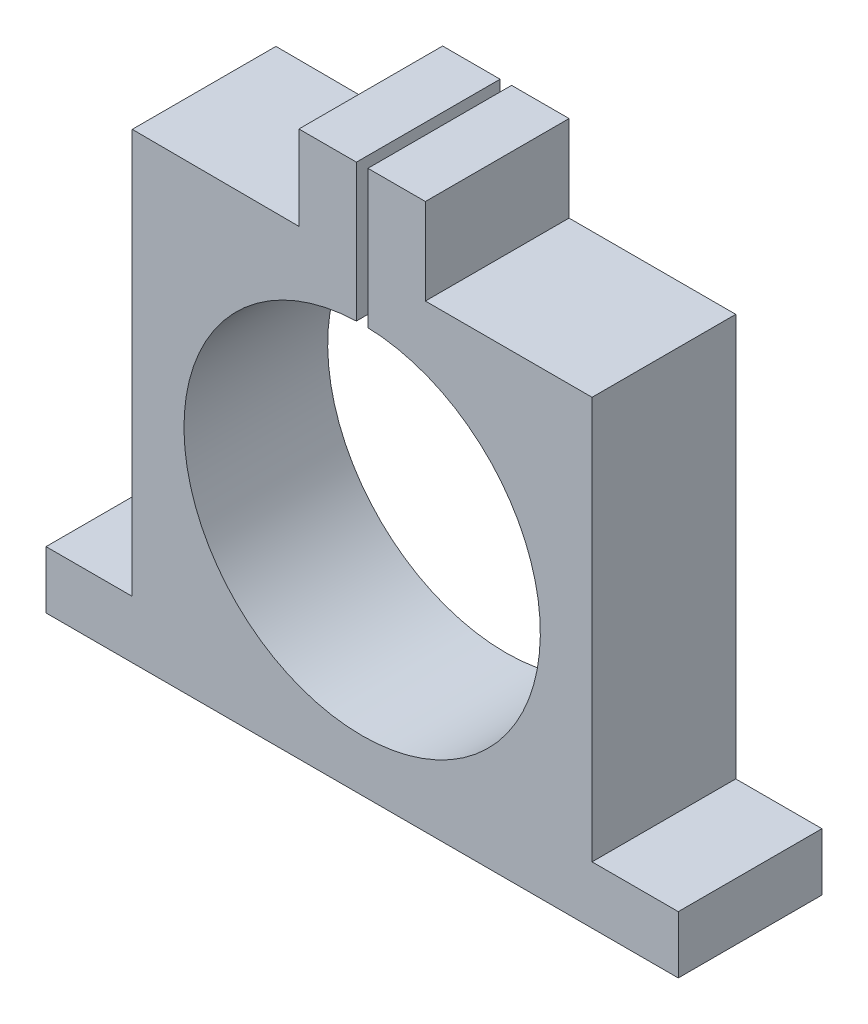
ISO-10303-21;
HEADER;
FILE_DESCRIPTION(('STEP AP214'),'2;1');
FILE_NAME('part.step','',(''),(''),'','','');
FILE_SCHEMA(('AUTOMOTIVE_DESIGN { 1 0 10303 214 1 1 1 1 }'));
ENDSEC;
DATA;
#1=APPLICATION_CONTEXT('core data for automotive mechanical design processes');
#2=APPLICATION_PROTOCOL_DEFINITION('international standard','automotive_design',2000,#1);
#3=PRODUCT_CONTEXT('',#1,'mechanical');
#4=PRODUCT('Part','Part','',(#3));
#5=PRODUCT_RELATED_PRODUCT_CATEGORY('part','',(#4));
#6=PRODUCT_DEFINITION_FORMATION('','',#4);
#7=PRODUCT_DEFINITION_CONTEXT('part definition',#1,'design');
#8=PRODUCT_DEFINITION('design','',#6,#7);
#9=PRODUCT_DEFINITION_SHAPE('','',#8);
#10=(LENGTH_UNIT() NAMED_UNIT(*) SI_UNIT(.MILLI.,.METRE.));
#11=(NAMED_UNIT(*) PLANE_ANGLE_UNIT() SI_UNIT($,.RADIAN.));
#12=(NAMED_UNIT(*) SI_UNIT($,.STERADIAN.) SOLID_ANGLE_UNIT());
#13=UNCERTAINTY_MEASURE_WITH_UNIT(LENGTH_MEASURE(1.E-05),#10,'distance_accuracy_value','');
#14=(GEOMETRIC_REPRESENTATION_CONTEXT(3) GLOBAL_UNCERTAINTY_ASSIGNED_CONTEXT((#13)) GLOBAL_UNIT_ASSIGNED_CONTEXT((#10,
#11,#12)) REPRESENTATION_CONTEXT('',''));
#15=CARTESIAN_POINT('',(0.,0.,0.));
#16=DIRECTION('',(0.,0.,1.));
#17=DIRECTION('',(1.,0.,0.));
#18=AXIS2_PLACEMENT_3D('',#15,#16,#17);
#19=CARTESIAN_POINT('',(-48.4217492630069,1.45139463650204,25.));
#20=DIRECTION('',(0.,0.,-1.));
#21=DIRECTION('',(-1.,0.,0.));
#22=AXIS2_PLACEMENT_3D('',#19,#20,#21);
#23=CYLINDRICAL_SURFACE('',#22,31.);
#24=CARTESIAN_POINT('',(-48.4217492630069,1.45139463650204,0.));
#25=DIRECTION('',(0.,0.,1.));
#26=DIRECTION('',(1.,0.,0.));
#27=AXIS2_PLACEMENT_3D('',#24,#25,#26);
#28=CIRCLE('',#27,31.);
#29=CARTESIAN_POINT('',(-49.4217492630069,32.4352614061614,0.));
#30=VERTEX_POINT('',#29);
#31=CARTESIAN_POINT('',(-47.4217492630069,32.4352614061614,0.));
#32=VERTEX_POINT('',#31);
#33=EDGE_CURVE('E174',#30,#32,#28,.T.);
#34=ORIENTED_EDGE('',*,*,#33,.F.);
#35=DIRECTION('',(0.,0.,-1.));
#36=VECTOR('',#35,1.);
#37=CARTESIAN_POINT('',(-49.4217492630069,32.4352614061614,25.));
#38=LINE('',#37,#36);
#39=CARTESIAN_POINT('',(-49.4217492630069,32.4352614061614,25.));
#40=VERTEX_POINT('',#39);
#41=EDGE_CURVE('E11',#40,#30,#38,.T.);
#42=ORIENTED_EDGE('',*,*,#41,.F.);
#43=CARTESIAN_POINT('',(-48.4217492630069,1.45139463650204,25.));
#44=DIRECTION('',(0.,0.,1.));
#45=DIRECTION('',(1.,0.,0.));
#46=AXIS2_PLACEMENT_3D('',#43,#44,#45);
#47=CIRCLE('',#46,31.);
#48=CARTESIAN_POINT('',(-47.4217492630069,32.4352614061614,25.));
#49=VERTEX_POINT('',#48);
#50=EDGE_CURVE('E206',#40,#49,#47,.T.);
#51=ORIENTED_EDGE('',*,*,#50,.T.);
#52=DIRECTION('',(0.,0.,-1.));
#53=VECTOR('',#52,1.);
#54=CARTESIAN_POINT('',(-47.4217492630069,32.4352614061614,25.));
#55=LINE('',#54,#53);
#56=EDGE_CURVE('E109',#49,#32,#55,.T.);
#57=ORIENTED_EDGE('',*,*,#56,.T.);
#58=EDGE_LOOP('',(#34,#42,#51,#57));
#59=FACE_BOUND('',#58,.T.);
#60=ADVANCED_FACE('F34',(#59),#23,.F.);
#61=CARTESIAN_POINT('',(-49.4217492630069,0.,25.));
#62=DIRECTION('',(1.,0.,0.));
#63=DIRECTION('',(0.,0.,-1.));
#64=AXIS2_PLACEMENT_3D('',#61,#62,#63);
#65=PLANE('',#64);
#66=DIRECTION('',(0.,-1.,0.));
#67=VECTOR('',#66,1.);
#68=CARTESIAN_POINT('',(-49.4217492630069,0.,0.));
#69=LINE('',#68,#67);
#70=CARTESIAN_POINT('',(-49.4217492630069,56.3802321548326,0.));
#71=VERTEX_POINT('',#70);
#72=EDGE_CURVE('E177',#71,#30,#69,.T.);
#73=ORIENTED_EDGE('',*,*,#72,.F.);
#74=DIRECTION('',(0.,0.,-1.));
#75=VECTOR('',#74,1.);
#76=CARTESIAN_POINT('',(-49.4217492630069,56.3802321548326,25.));
#77=LINE('',#76,#75);
#78=CARTESIAN_POINT('',(-49.4217492630069,56.3802321548326,25.));
#79=VERTEX_POINT('',#78);
#80=EDGE_CURVE('E42',#79,#71,#77,.T.);
#81=ORIENTED_EDGE('',*,*,#80,.F.);
#82=DIRECTION('',(0.,-1.,0.));
#83=VECTOR('',#82,1.);
#84=CARTESIAN_POINT('',(-49.4217492630069,0.,25.));
#85=LINE('',#84,#83);
#86=EDGE_CURVE('E254',#79,#40,#85,.T.);
#87=ORIENTED_EDGE('',*,*,#86,.T.);
#88=ORIENTED_EDGE('',*,*,#41,.T.);
#89=EDGE_LOOP('',(#73,#81,#87,#88));
#90=FACE_BOUND('',#89,.T.);
#91=ADVANCED_FACE('F253',(#90),#65,.T.);
#92=CARTESIAN_POINT('',(0.,56.3802321548326,25.));
#93=DIRECTION('',(0.,-1.,0.));
#94=DIRECTION('',(0.,0.,-1.));
#95=AXIS2_PLACEMENT_3D('',#92,#93,#94);
#96=PLANE('',#95);
#97=DIRECTION('',(-1.,0.,0.));
#98=VECTOR('',#97,1.);
#99=CARTESIAN_POINT('',(0.,56.3802321548326,0.));
#100=LINE('',#99,#98);
#101=CARTESIAN_POINT('',(-59.4217492630069,56.3802321548326,0.));
#102=VERTEX_POINT('',#101);
#103=EDGE_CURVE('E180',#71,#102,#100,.T.);
#104=ORIENTED_EDGE('',*,*,#103,.T.);
#105=DIRECTION('',(0.,0.,-1.));
#106=VECTOR('',#105,1.);
#107=CARTESIAN_POINT('',(-59.4217492630069,56.3802321548326,25.));
#108=LINE('',#107,#106);
#109=CARTESIAN_POINT('',(-59.4217492630069,56.3802321548326,25.));
#110=VERTEX_POINT('',#109);
#111=EDGE_CURVE('E237',#110,#102,#108,.T.);
#112=ORIENTED_EDGE('',*,*,#111,.F.);
#113=DIRECTION('',(-1.,0.,0.));
#114=VECTOR('',#113,1.);
#115=CARTESIAN_POINT('',(0.,56.3802321548326,25.));
#116=LINE('',#115,#114);
#117=EDGE_CURVE('E244',#79,#110,#116,.T.);
#118=ORIENTED_EDGE('',*,*,#117,.F.);
#119=ORIENTED_EDGE('',*,*,#80,.T.);
#120=EDGE_LOOP('',(#104,#112,#118,#119));
#121=FACE_BOUND('',#120,.T.);
#122=ADVANCED_FACE('F242',(#121),#96,.F.);
#123=CARTESIAN_POINT('',(-59.4217492630069,0.,25.));
#124=DIRECTION('',(1.,0.,0.));
#125=DIRECTION('',(0.,0.,-1.));
#126=AXIS2_PLACEMENT_3D('',#123,#124,#125);
#127=PLANE('',#126);
#128=DIRECTION('',(0.,-1.,0.));
#129=VECTOR('',#128,1.);
#130=CARTESIAN_POINT('',(-59.4217492630069,0.,0.));
#131=LINE('',#130,#129);
#132=CARTESIAN_POINT('',(-59.4217492630069,41.7047328651163,0.));
#133=VERTEX_POINT('',#132);
#134=EDGE_CURVE('E182',#102,#133,#131,.T.);
#135=ORIENTED_EDGE('',*,*,#134,.T.);
#136=DIRECTION('',(0.,0.,-1.));
#137=VECTOR('',#136,1.);
#138=CARTESIAN_POINT('',(-59.4217492630069,41.7047328651163,25.));
#139=LINE('',#138,#137);
#140=CARTESIAN_POINT('',(-59.4217492630069,41.7047328651163,25.));
#141=VERTEX_POINT('',#140);
#142=EDGE_CURVE('E234',#141,#133,#139,.T.);
#143=ORIENTED_EDGE('',*,*,#142,.F.);
#144=DIRECTION('',(0.,-1.,0.));
#145=VECTOR('',#144,1.);
#146=CARTESIAN_POINT('',(-59.4217492630069,0.,25.));
#147=LINE('',#146,#145);
#148=EDGE_CURVE('E262',#110,#141,#147,.T.);
#149=ORIENTED_EDGE('',*,*,#148,.F.);
#150=ORIENTED_EDGE('',*,*,#111,.T.);
#151=EDGE_LOOP('',(#135,#143,#149,#150));
#152=FACE_BOUND('',#151,.T.);
#153=ADVANCED_FACE('F324',(#152),#127,.F.);
#154=CARTESIAN_POINT('',(0.171375530697008,41.4583942508996,25.));
#155=DIRECTION('',(-0.00413363975239123,-0.999991456474703,0.));
#156=DIRECTION('',(0.999991456474703,-0.00413363975239123,0.));
#157=AXIS2_PLACEMENT_3D('',#154,#155,#156);
#158=PLANE('',#157);
#159=DIRECTION('',(-0.999991456474703,0.00413363975239123,0.));
#160=VECTOR('',#159,1.);
#161=CARTESIAN_POINT('',(0.171375530697008,41.4583942508996,0.));
#162=LINE('',#161,#160);
#163=CARTESIAN_POINT('',(-88.4217492630069,41.8246094421042,0.));
#164=VERTEX_POINT('',#163);
#165=EDGE_CURVE('E184',#133,#164,#162,.T.);
#166=ORIENTED_EDGE('',*,*,#165,.T.);
#167=DIRECTION('',(0.,0.,-1.));
#168=VECTOR('',#167,1.);
#169=CARTESIAN_POINT('',(-88.4217492630069,41.8246094421042,25.));
#170=LINE('',#169,#168);
#171=CARTESIAN_POINT('',(-88.4217492630069,41.8246094421042,25.));
#172=VERTEX_POINT('',#171);
#173=EDGE_CURVE('E231',#172,#164,#170,.T.);
#174=ORIENTED_EDGE('',*,*,#173,.F.);
#175=DIRECTION('',(-0.999991456474703,0.00413363975239123,0.));
#176=VECTOR('',#175,1.);
#177=CARTESIAN_POINT('',(0.171375530697008,41.4583942508996,25.));
#178=LINE('',#177,#176);
#179=EDGE_CURVE('E264',#141,#172,#178,.T.);
#180=ORIENTED_EDGE('',*,*,#179,.F.);
#181=ORIENTED_EDGE('',*,*,#142,.T.);
#182=EDGE_LOOP('',(#166,#174,#180,#181));
#183=FACE_BOUND('',#182,.T.);
#184=ADVANCED_FACE('F319',(#183),#158,.F.);
#185=CARTESIAN_POINT('',(-88.4217492630069,0.,25.));
#186=DIRECTION('',(1.,0.,0.));
#187=DIRECTION('',(0.,1.,0.));
#188=AXIS2_PLACEMENT_3D('',#185,#186,#187);
#189=PLANE('',#188);
#190=DIRECTION('',(0.,-1.,0.));
#191=VECTOR('',#190,1.);
#192=CARTESIAN_POINT('',(-88.4217492630069,0.,0.));
#193=LINE('',#192,#191);
#194=CARTESIAN_POINT('',(-88.4217492630069,-28.548605363498,0.));
#195=VERTEX_POINT('',#194);
#196=EDGE_CURVE('E186',#164,#195,#193,.T.);
#197=ORIENTED_EDGE('',*,*,#196,.T.);
#198=DIRECTION('',(0.,0.,-1.));
#199=VECTOR('',#198,1.);
#200=CARTESIAN_POINT('',(-88.4217492630069,-28.548605363498,25.));
#201=LINE('',#200,#199);
#202=CARTESIAN_POINT('',(-88.4217492630069,-28.548605363498,25.));
#203=VERTEX_POINT('',#202);
#204=EDGE_CURVE('E228',#203,#195,#201,.T.);
#205=ORIENTED_EDGE('',*,*,#204,.F.);
#206=DIRECTION('',(0.,-1.,0.));
#207=VECTOR('',#206,1.);
#208=CARTESIAN_POINT('',(-88.4217492630069,0.,25.));
#209=LINE('',#208,#207);
#210=EDGE_CURVE('E266',#172,#203,#209,.T.);
#211=ORIENTED_EDGE('',*,*,#210,.F.);
#212=ORIENTED_EDGE('',*,*,#173,.T.);
#213=EDGE_LOOP('',(#197,#205,#211,#212));
#214=FACE_BOUND('',#213,.T.);
#215=ADVANCED_FACE('F316',(#214),#189,.F.);
#216=CARTESIAN_POINT('',(0.,-28.548605363498,25.));
#217=DIRECTION('',(0.,-1.,0.));
#218=DIRECTION('',(0.,0.,-1.));
#219=AXIS2_PLACEMENT_3D('',#216,#217,#218);
#220=PLANE('',#219);
#221=DIRECTION('',(-1.,0.,0.));
#222=VECTOR('',#221,1.);
#223=CARTESIAN_POINT('',(0.,-28.548605363498,0.));
#224=LINE('',#223,#222);
#225=CARTESIAN_POINT('',(-103.421749263007,-28.548605363498,0.));
#226=VERTEX_POINT('',#225);
#227=EDGE_CURVE('E188',#195,#226,#224,.T.);
#228=ORIENTED_EDGE('',*,*,#227,.T.);
#229=DIRECTION('',(0.,0.,-1.));
#230=VECTOR('',#229,1.);
#231=CARTESIAN_POINT('',(-103.421749263007,-28.548605363498,25.));
#232=LINE('',#231,#230);
#233=CARTESIAN_POINT('',(-103.421749263007,-28.548605363498,25.));
#234=VERTEX_POINT('',#233);
#235=EDGE_CURVE('E225',#234,#226,#232,.T.);
#236=ORIENTED_EDGE('',*,*,#235,.F.);
#237=DIRECTION('',(-1.,0.,0.));
#238=VECTOR('',#237,1.);
#239=CARTESIAN_POINT('',(0.,-28.548605363498,25.));
#240=LINE('',#239,#238);
#241=EDGE_CURVE('E268',#203,#234,#240,.T.);
#242=ORIENTED_EDGE('',*,*,#241,.F.);
#243=ORIENTED_EDGE('',*,*,#204,.T.);
#244=EDGE_LOOP('',(#228,#236,#242,#243));
#245=FACE_BOUND('',#244,.T.);
#246=ADVANCED_FACE('F312',(#245),#220,.F.);
#247=CARTESIAN_POINT('',(-103.421749263007,0.,25.));
#248=DIRECTION('',(1.,0.,0.));
#249=DIRECTION('',(0.,0.,-1.));
#250=AXIS2_PLACEMENT_3D('',#247,#248,#249);
#251=PLANE('',#250);
#252=DIRECTION('',(0.,-1.,0.));
#253=VECTOR('',#252,1.);
#254=CARTESIAN_POINT('',(-103.421749263007,0.,0.));
#255=LINE('',#254,#253);
#256=CARTESIAN_POINT('',(-103.421749263007,-38.548605363498,0.));
#257=VERTEX_POINT('',#256);
#258=EDGE_CURVE('E190',#226,#257,#255,.T.);
#259=ORIENTED_EDGE('',*,*,#258,.T.);
#260=DIRECTION('',(0.,0.,-1.));
#261=VECTOR('',#260,1.);
#262=CARTESIAN_POINT('',(-103.421749263007,-38.548605363498,25.));
#263=LINE('',#262,#261);
#264=CARTESIAN_POINT('',(-103.421749263007,-38.548605363498,25.));
#265=VERTEX_POINT('',#264);
#266=EDGE_CURVE('E222',#265,#257,#263,.T.);
#267=ORIENTED_EDGE('',*,*,#266,.F.);
#268=DIRECTION('',(0.,-1.,0.));
#269=VECTOR('',#268,1.);
#270=CARTESIAN_POINT('',(-103.421749263007,0.,25.));
#271=LINE('',#270,#269);
#272=EDGE_CURVE('E270',#234,#265,#271,.T.);
#273=ORIENTED_EDGE('',*,*,#272,.F.);
#274=ORIENTED_EDGE('',*,*,#235,.T.);
#275=EDGE_LOOP('',(#259,#267,#273,#274));
#276=FACE_BOUND('',#275,.T.);
#277=ADVANCED_FACE('F307',(#276),#251,.F.);
#278=CARTESIAN_POINT('',(0.,-38.548605363498,25.));
#279=DIRECTION('',(0.,1.,0.));
#280=DIRECTION('',(0.,0.,1.));
#281=AXIS2_PLACEMENT_3D('',#278,#279,#280);
#282=PLANE('',#281);
#283=DIRECTION('',(1.,0.,0.));
#284=VECTOR('',#283,1.);
#285=CARTESIAN_POINT('',(0.,-38.548605363498,0.));
#286=LINE('',#285,#284);
#287=CARTESIAN_POINT('',(6.57825073699307,-38.548605363498,0.));
#288=VERTEX_POINT('',#287);
#289=EDGE_CURVE('E192',#257,#288,#286,.T.);
#290=ORIENTED_EDGE('',*,*,#289,.T.);
#291=DIRECTION('',(0.,0.,-1.));
#292=VECTOR('',#291,1.);
#293=CARTESIAN_POINT('',(6.57825073699307,-38.548605363498,25.));
#294=LINE('',#293,#292);
#295=CARTESIAN_POINT('',(6.57825073699307,-38.548605363498,25.));
#296=VERTEX_POINT('',#295);
#297=EDGE_CURVE('E219',#296,#288,#294,.T.);
#298=ORIENTED_EDGE('',*,*,#297,.F.);
#299=DIRECTION('',(1.,0.,0.));
#300=VECTOR('',#299,1.);
#301=CARTESIAN_POINT('',(0.,-38.548605363498,25.));
#302=LINE('',#301,#300);
#303=EDGE_CURVE('E272',#265,#296,#302,.T.);
#304=ORIENTED_EDGE('',*,*,#303,.F.);
#305=ORIENTED_EDGE('',*,*,#266,.T.);
#306=EDGE_LOOP('',(#290,#298,#304,#305));
#307=FACE_BOUND('',#306,.T.);
#308=ADVANCED_FACE('F301',(#307),#282,.F.);
#309=CARTESIAN_POINT('',(6.57825073699307,0.,25.));
#310=DIRECTION('',(-1.,0.,0.));
#311=DIRECTION('',(0.,0.,1.));
#312=AXIS2_PLACEMENT_3D('',#309,#310,#311);
#313=PLANE('',#312);
#314=DIRECTION('',(0.,1.,0.));
#315=VECTOR('',#314,1.);
#316=CARTESIAN_POINT('',(6.57825073699307,0.,0.));
#317=LINE('',#316,#315);
#318=CARTESIAN_POINT('',(6.57825073699307,-28.548605363498,0.));
#319=VERTEX_POINT('',#318);
#320=EDGE_CURVE('E194',#288,#319,#317,.T.);
#321=ORIENTED_EDGE('',*,*,#320,.T.);
#322=DIRECTION('',(0.,0.,-1.));
#323=VECTOR('',#322,1.);
#324=CARTESIAN_POINT('',(6.57825073699307,-28.548605363498,25.));
#325=LINE('',#324,#323);
#326=CARTESIAN_POINT('',(6.57825073699307,-28.548605363498,25.));
#327=VERTEX_POINT('',#326);
#328=EDGE_CURVE('E216',#327,#319,#325,.T.);
#329=ORIENTED_EDGE('',*,*,#328,.F.);
#330=DIRECTION('',(0.,1.,0.));
#331=VECTOR('',#330,1.);
#332=CARTESIAN_POINT('',(6.57825073699307,0.,25.));
#333=LINE('',#332,#331);
#334=EDGE_CURVE('E274',#296,#327,#333,.T.);
#335=ORIENTED_EDGE('',*,*,#334,.F.);
#336=ORIENTED_EDGE('',*,*,#297,.T.);
#337=EDGE_LOOP('',(#321,#329,#335,#336));
#338=FACE_BOUND('',#337,.T.);
#339=ADVANCED_FACE('F297',(#338),#313,.F.);
#340=CARTESIAN_POINT('',(0.,-28.548605363498,25.));
#341=DIRECTION('',(0.,-1.,0.));
#342=DIRECTION('',(1.,0.,0.));
#343=AXIS2_PLACEMENT_3D('',#340,#341,#342);
#344=PLANE('',#343);
#345=DIRECTION('',(-1.,0.,0.));
#346=VECTOR('',#345,1.);
#347=CARTESIAN_POINT('',(0.,-28.548605363498,0.));
#348=LINE('',#347,#346);
#349=CARTESIAN_POINT('',(-8.42174926300693,-28.548605363498,0.));
#350=VERTEX_POINT('',#349);
#351=EDGE_CURVE('E196',#319,#350,#348,.T.);
#352=ORIENTED_EDGE('',*,*,#351,.T.);
#353=DIRECTION('',(0.,0.,-1.));
#354=VECTOR('',#353,1.);
#355=CARTESIAN_POINT('',(-8.42174926300693,-28.548605363498,25.));
#356=LINE('',#355,#354);
#357=CARTESIAN_POINT('',(-8.42174926300693,-28.548605363498,25.));
#358=VERTEX_POINT('',#357);
#359=EDGE_CURVE('E213',#358,#350,#356,.T.);
#360=ORIENTED_EDGE('',*,*,#359,.F.);
#361=DIRECTION('',(-1.,0.,0.));
#362=VECTOR('',#361,1.);
#363=CARTESIAN_POINT('',(0.,-28.548605363498,25.));
#364=LINE('',#363,#362);
#365=EDGE_CURVE('E276',#327,#358,#364,.T.);
#366=ORIENTED_EDGE('',*,*,#365,.F.);
#367=ORIENTED_EDGE('',*,*,#328,.T.);
#368=EDGE_LOOP('',(#352,#360,#366,#367));
#369=FACE_BOUND('',#368,.T.);
#370=ADVANCED_FACE('F293',(#369),#344,.F.);
#371=CARTESIAN_POINT('',(-8.42174926300693,0.,25.));
#372=DIRECTION('',(-1.,0.,0.));
#373=DIRECTION('',(0.,0.,1.));
#374=AXIS2_PLACEMENT_3D('',#371,#372,#373);
#375=PLANE('',#374);
#376=DIRECTION('',(0.,1.,0.));
#377=VECTOR('',#376,1.);
#378=CARTESIAN_POINT('',(-8.42174926300693,0.,0.));
#379=LINE('',#378,#377);
#380=CARTESIAN_POINT('',(-8.42174926300693,41.451394636502,0.));
#381=VERTEX_POINT('',#380);
#382=EDGE_CURVE('E198',#350,#381,#379,.T.);
#383=ORIENTED_EDGE('',*,*,#382,.T.);
#384=DIRECTION('',(0.,0.,-1.));
#385=VECTOR('',#384,1.);
#386=CARTESIAN_POINT('',(-8.42174926300693,41.451394636502,25.));
#387=LINE('',#386,#385);
#388=CARTESIAN_POINT('',(-8.42174926300693,41.451394636502,25.));
#389=VERTEX_POINT('',#388);
#390=EDGE_CURVE('E210',#389,#381,#387,.T.);
#391=ORIENTED_EDGE('',*,*,#390,.F.);
#392=DIRECTION('',(0.,1.,0.));
#393=VECTOR('',#392,1.);
#394=CARTESIAN_POINT('',(-8.42174926300693,0.,25.));
#395=LINE('',#394,#393);
#396=EDGE_CURVE('E278',#358,#389,#395,.T.);
#397=ORIENTED_EDGE('',*,*,#396,.F.);
#398=ORIENTED_EDGE('',*,*,#359,.T.);
#399=EDGE_LOOP('',(#383,#391,#397,#398));
#400=FACE_BOUND('',#399,.T.);
#401=ADVANCED_FACE('F284',(#400),#375,.F.);
#402=CARTESIAN_POINT('',(0.,41.451394636502,25.));
#403=DIRECTION('',(0.,-1.,0.));
#404=DIRECTION('',(1.,0.,0.));
#405=AXIS2_PLACEMENT_3D('',#402,#403,#404);
#406=PLANE('',#405);
#407=DIRECTION('',(-1.,0.,0.));
#408=VECTOR('',#407,1.);
#409=CARTESIAN_POINT('',(0.,41.451394636502,0.));
#410=LINE('',#409,#408);
#411=CARTESIAN_POINT('',(-37.4217492630069,41.451394636502,0.));
#412=VERTEX_POINT('',#411);
#413=EDGE_CURVE('E200',#381,#412,#410,.T.);
#414=ORIENTED_EDGE('',*,*,#413,.T.);
#415=DIRECTION('',(0.,0.,-1.));
#416=VECTOR('',#415,1.);
#417=CARTESIAN_POINT('',(-37.4217492630069,41.451394636502,25.));
#418=LINE('',#417,#416);
#419=CARTESIAN_POINT('',(-37.4217492630069,41.451394636502,25.));
#420=VERTEX_POINT('',#419);
#421=EDGE_CURVE('E166',#420,#412,#418,.T.);
#422=ORIENTED_EDGE('',*,*,#421,.F.);
#423=DIRECTION('',(-1.,0.,0.));
#424=VECTOR('',#423,1.);
#425=CARTESIAN_POINT('',(0.,41.451394636502,25.));
#426=LINE('',#425,#424);
#427=EDGE_CURVE('E157',#389,#420,#426,.T.);
#428=ORIENTED_EDGE('',*,*,#427,.F.);
#429=ORIENTED_EDGE('',*,*,#390,.T.);
#430=EDGE_LOOP('',(#414,#422,#428,#429));
#431=FACE_BOUND('',#430,.T.);
#432=ADVANCED_FACE('F288',(#431),#406,.F.);
#433=CARTESIAN_POINT('',(-37.4217492630069,0.,25.));
#434=DIRECTION('',(-1.,0.,0.));
#435=DIRECTION('',(0.,0.,1.));
#436=AXIS2_PLACEMENT_3D('',#433,#434,#435);
#437=PLANE('',#436);
#438=DIRECTION('',(0.,1.,0.));
#439=VECTOR('',#438,1.);
#440=CARTESIAN_POINT('',(-37.4217492630069,0.,0.));
#441=LINE('',#440,#439);
#442=CARTESIAN_POINT('',(-37.4217492630069,56.451394636502,0.));
#443=VERTEX_POINT('',#442);
#444=EDGE_CURVE('E165',#412,#443,#441,.T.);
#445=ORIENTED_EDGE('',*,*,#444,.T.);
#446=DIRECTION('',(0.,0.,-1.));
#447=VECTOR('',#446,1.);
#448=CARTESIAN_POINT('',(-37.4217492630069,56.451394636502,25.));
#449=LINE('',#448,#447);
#450=CARTESIAN_POINT('',(-37.4217492630069,56.451394636502,25.));
#451=VERTEX_POINT('',#450);
#452=EDGE_CURVE('E162',#451,#443,#449,.T.);
#453=ORIENTED_EDGE('',*,*,#452,.F.);
#454=DIRECTION('',(0.,1.,0.));
#455=VECTOR('',#454,1.);
#456=CARTESIAN_POINT('',(-37.4217492630069,0.,25.));
#457=LINE('',#456,#455);
#458=EDGE_CURVE('E151',#420,#451,#457,.T.);
#459=ORIENTED_EDGE('',*,*,#458,.F.);
#460=ORIENTED_EDGE('',*,*,#421,.T.);
#461=EDGE_LOOP('',(#445,#453,#459,#460));
#462=FACE_BOUND('',#461,.T.);
#463=ADVANCED_FACE('F163',(#462),#437,.F.);
#464=CARTESIAN_POINT('',(0.,56.451394636502,25.));
#465=DIRECTION('',(0.,-1.,0.));
#466=DIRECTION('',(0.,0.,-1.));
#467=AXIS2_PLACEMENT_3D('',#464,#465,#466);
#468=PLANE('',#467);
#469=DIRECTION('',(-1.,0.,0.));
#470=VECTOR('',#469,1.);
#471=CARTESIAN_POINT('',(0.,56.451394636502,0.));
#472=LINE('',#471,#470);
#473=CARTESIAN_POINT('',(-47.4217492630069,56.451394636502,0.));
#474=VERTEX_POINT('',#473);
#475=EDGE_CURVE('E102',#443,#474,#472,.T.);
#476=ORIENTED_EDGE('',*,*,#475,.T.);
#477=DIRECTION('',(0.,0.,-1.));
#478=VECTOR('',#477,1.);
#479=CARTESIAN_POINT('',(-47.4217492630069,56.451394636502,25.));
#480=LINE('',#479,#478);
#481=CARTESIAN_POINT('',(-47.4217492630069,56.451394636502,25.));
#482=VERTEX_POINT('',#481);
#483=EDGE_CURVE('E167',#482,#474,#480,.T.);
#484=ORIENTED_EDGE('',*,*,#483,.F.);
#485=DIRECTION('',(-1.,0.,0.));
#486=VECTOR('',#485,1.);
#487=CARTESIAN_POINT('',(0.,56.451394636502,25.));
#488=LINE('',#487,#486);
#489=EDGE_CURVE('E155',#451,#482,#488,.T.);
#490=ORIENTED_EDGE('',*,*,#489,.F.);
#491=ORIENTED_EDGE('',*,*,#452,.T.);
#492=EDGE_LOOP('',(#476,#484,#490,#491));
#493=FACE_BOUND('',#492,.T.);
#494=ADVANCED_FACE('F169',(#493),#468,.F.);
#495=CARTESIAN_POINT('',(-47.4217492630069,0.,25.));
#496=DIRECTION('',(1.,0.,0.));
#497=DIRECTION('',(0.,0.,-1.));
#498=AXIS2_PLACEMENT_3D('',#495,#496,#497);
#499=PLANE('',#498);
#500=DIRECTION('',(0.,-1.,0.));
#501=VECTOR('',#500,1.);
#502=CARTESIAN_POINT('',(-47.4217492630069,0.,0.));
#503=LINE('',#502,#501);
#504=EDGE_CURVE('E204',#474,#32,#503,.T.);
#505=ORIENTED_EDGE('',*,*,#504,.T.);
#506=ORIENTED_EDGE('',*,*,#56,.F.);
#507=DIRECTION('',(0.,-1.,0.));
#508=VECTOR('',#507,1.);
#509=CARTESIAN_POINT('',(-47.4217492630069,0.,25.));
#510=LINE('',#509,#508);
#511=EDGE_CURVE('E50',#482,#49,#510,.T.);
#512=ORIENTED_EDGE('',*,*,#511,.F.);
#513=ORIENTED_EDGE('',*,*,#483,.T.);
#514=EDGE_LOOP('',(#505,#506,#512,#513));
#515=FACE_BOUND('',#514,.T.);
#516=ADVANCED_FACE('F257',(#515),#499,.F.);
#517=CARTESIAN_POINT('',(0.,0.,25.));
#518=DIRECTION('',(0.,0.,1.));
#519=DIRECTION('',(1.,0.,0.));
#520=AXIS2_PLACEMENT_3D('',#517,#518,#519);
#521=PLANE('',#520);
#522=ORIENTED_EDGE('',*,*,#50,.F.);
#523=ORIENTED_EDGE('',*,*,#86,.F.);
#524=ORIENTED_EDGE('',*,*,#117,.T.);
#525=ORIENTED_EDGE('',*,*,#148,.T.);
#526=ORIENTED_EDGE('',*,*,#179,.T.);
#527=ORIENTED_EDGE('',*,*,#210,.T.);
#528=ORIENTED_EDGE('',*,*,#241,.T.);
#529=ORIENTED_EDGE('',*,*,#272,.T.);
#530=ORIENTED_EDGE('',*,*,#303,.T.);
#531=ORIENTED_EDGE('',*,*,#334,.T.);
#532=ORIENTED_EDGE('',*,*,#365,.T.);
#533=ORIENTED_EDGE('',*,*,#396,.T.);
#534=ORIENTED_EDGE('',*,*,#427,.T.);
#535=ORIENTED_EDGE('',*,*,#458,.T.);
#536=ORIENTED_EDGE('',*,*,#489,.T.);
#537=ORIENTED_EDGE('',*,*,#511,.T.);
#538=EDGE_LOOP('',(#522,#523,#524,#525,#526,#527,#528,#529,#530,#531,#532,#533,#534,#535,#536,#537));
#539=FACE_BOUND('',#538,.T.);
#540=ADVANCED_FACE('F153',(#539),#521,.T.);
#541=CARTESIAN_POINT('',(0.,0.,0.));
#542=DIRECTION('',(0.,0.,1.));
#543=DIRECTION('',(1.,0.,0.));
#544=AXIS2_PLACEMENT_3D('',#541,#542,#543);
#545=PLANE('',#544);
#546=ORIENTED_EDGE('',*,*,#33,.T.);
#547=ORIENTED_EDGE('',*,*,#504,.F.);
#548=ORIENTED_EDGE('',*,*,#475,.F.);
#549=ORIENTED_EDGE('',*,*,#444,.F.);
#550=ORIENTED_EDGE('',*,*,#413,.F.);
#551=ORIENTED_EDGE('',*,*,#382,.F.);
#552=ORIENTED_EDGE('',*,*,#351,.F.);
#553=ORIENTED_EDGE('',*,*,#320,.F.);
#554=ORIENTED_EDGE('',*,*,#289,.F.);
#555=ORIENTED_EDGE('',*,*,#258,.F.);
#556=ORIENTED_EDGE('',*,*,#227,.F.);
#557=ORIENTED_EDGE('',*,*,#196,.F.);
#558=ORIENTED_EDGE('',*,*,#165,.F.);
#559=ORIENTED_EDGE('',*,*,#134,.F.);
#560=ORIENTED_EDGE('',*,*,#103,.F.);
#561=ORIENTED_EDGE('',*,*,#72,.T.);
#562=EDGE_LOOP('',(#546,#547,#548,#549,#550,#551,#552,#553,#554,#555,#556,#557,#558,#559,#560,#561));
#563=FACE_BOUND('',#562,.T.);
#564=ADVANCED_FACE('F251',(#563),#545,.F.);
#565=CLOSED_SHELL('',(#60,#91,#122,#153,#184,#215,#246,#277,#308,#339,#370,#401,#432,#463,#494,
#516,#540,#564));
#566=MANIFOLD_SOLID_BREP('B2',#565);
#567=ADVANCED_BREP_SHAPE_REPRESENTATION('',(#18,#566),#14);
#568=SHAPE_DEFINITION_REPRESENTATION(#9,#567);
ENDSEC;
END-ISO-10303-21;
